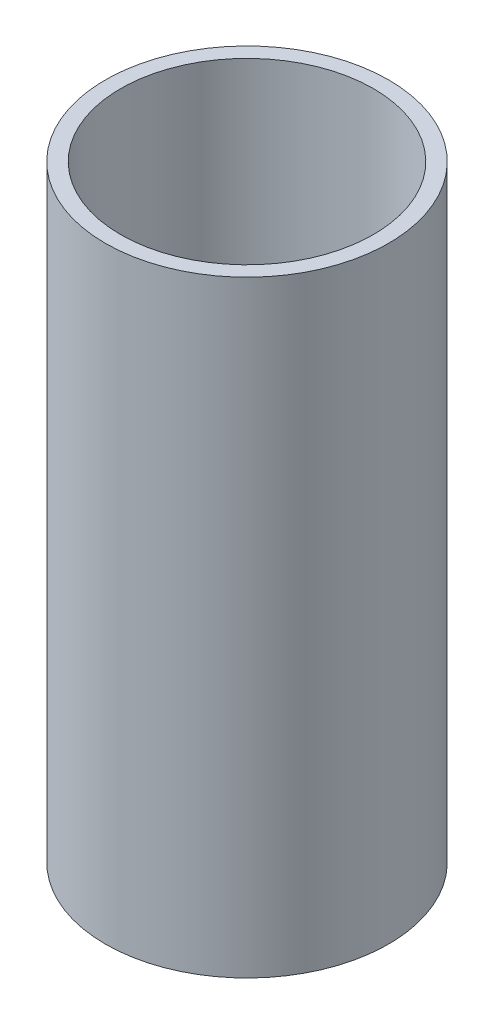
ISO-10303-21;
HEADER;
FILE_DESCRIPTION(('STEP AP214'),'2;1');
FILE_NAME('part.step','',(''),(''),'','','');
FILE_SCHEMA(('AUTOMOTIVE_DESIGN { 1 0 10303 214 1 1 1 1 }'));
ENDSEC;
DATA;
#1=APPLICATION_CONTEXT('core data for automotive mechanical design processes');
#2=APPLICATION_PROTOCOL_DEFINITION('international standard','automotive_design',2000,#1);
#3=PRODUCT_CONTEXT('',#1,'mechanical');
#4=PRODUCT('Part','Part','',(#3));
#5=PRODUCT_RELATED_PRODUCT_CATEGORY('part','',(#4));
#6=PRODUCT_DEFINITION_FORMATION('','',#4);
#7=PRODUCT_DEFINITION_CONTEXT('part definition',#1,'design');
#8=PRODUCT_DEFINITION('design','',#6,#7);
#9=PRODUCT_DEFINITION_SHAPE('','',#8);
#10=(LENGTH_UNIT() NAMED_UNIT(*) SI_UNIT(.MILLI.,.METRE.));
#11=(NAMED_UNIT(*) PLANE_ANGLE_UNIT() SI_UNIT($,.RADIAN.));
#12=(NAMED_UNIT(*) SI_UNIT($,.STERADIAN.) SOLID_ANGLE_UNIT());
#13=UNCERTAINTY_MEASURE_WITH_UNIT(LENGTH_MEASURE(1.E-05),#10,'distance_accuracy_value','');
#14=(GEOMETRIC_REPRESENTATION_CONTEXT(3) GLOBAL_UNCERTAINTY_ASSIGNED_CONTEXT((#13)) GLOBAL_UNIT_ASSIGNED_CONTEXT((#10,
#11,#12)) REPRESENTATION_CONTEXT('',''));
#15=CARTESIAN_POINT('',(0.,0.,0.));
#16=DIRECTION('',(0.,0.,1.));
#17=DIRECTION('',(1.,0.,0.));
#18=AXIS2_PLACEMENT_3D('',#15,#16,#17);
#19=CARTESIAN_POINT('',(0.,60.,0.));
#20=DIRECTION('',(0.,1.,0.));
#21=DIRECTION('',(0.,0.,1.));
#22=AXIS2_PLACEMENT_3D('',#19,#20,#21);
#23=PLANE('',#22);
#24=CARTESIAN_POINT('',(0.,60.,0.));
#25=DIRECTION('',(0.,1.,0.));
#26=DIRECTION('',(0.,0.,1.));
#27=AXIS2_PLACEMENT_3D('',#24,#25,#26);
#28=CIRCLE('',#27,14.);
#29=CARTESIAN_POINT('',(0.,60.,14.));
#30=VERTEX_POINT('',#29);
#31=EDGE_CURVE('E10',#30,#30,#28,.T.);
#32=ORIENTED_EDGE('',*,*,#31,.T.);
#33=EDGE_LOOP('',(#32));
#34=FACE_BOUND('',#33,.T.);
#35=CARTESIAN_POINT('',(0.,60.,0.));
#36=DIRECTION('',(0.,1.,0.));
#37=DIRECTION('',(0.,0.,1.));
#38=AXIS2_PLACEMENT_3D('',#35,#36,#37);
#39=CIRCLE('',#38,12.5);
#40=CARTESIAN_POINT('',(0.,60.,12.5));
#41=VERTEX_POINT('',#40);
#42=EDGE_CURVE('E42',#41,#41,#39,.T.);
#43=ORIENTED_EDGE('',*,*,#42,.F.);
#44=EDGE_LOOP('',(#43));
#45=FACE_BOUND('',#44,.T.);
#46=ADVANCED_FACE('F31',(#34,#45),#23,.T.);
#47=CARTESIAN_POINT('',(0.,0.,0.));
#48=DIRECTION('',(0.,1.,0.));
#49=DIRECTION('',(0.,0.,1.));
#50=AXIS2_PLACEMENT_3D('',#47,#48,#49);
#51=PLANE('',#50);
#52=CARTESIAN_POINT('',(0.,0.,0.));
#53=DIRECTION('',(0.,1.,0.));
#54=DIRECTION('',(0.,0.,1.));
#55=AXIS2_PLACEMENT_3D('',#52,#53,#54);
#56=CIRCLE('',#55,14.);
#57=CARTESIAN_POINT('',(0.,0.,14.));
#58=VERTEX_POINT('',#57);
#59=EDGE_CURVE('E35',#58,#58,#56,.T.);
#60=ORIENTED_EDGE('',*,*,#59,.F.);
#61=EDGE_LOOP('',(#60));
#62=FACE_BOUND('',#61,.T.);
#63=CARTESIAN_POINT('',(0.,0.,0.));
#64=DIRECTION('',(0.,1.,0.));
#65=DIRECTION('',(0.,0.,1.));
#66=AXIS2_PLACEMENT_3D('',#63,#64,#65);
#67=CIRCLE('',#66,12.5);
#68=CARTESIAN_POINT('',(0.,0.,12.5));
#69=VERTEX_POINT('',#68);
#70=EDGE_CURVE('E44',#69,#69,#67,.T.);
#71=ORIENTED_EDGE('',*,*,#70,.T.);
#72=EDGE_LOOP('',(#71));
#73=FACE_BOUND('',#72,.T.);
#74=ADVANCED_FACE('F54',(#62,#73),#51,.F.);
#75=CARTESIAN_POINT('',(0.,60.,0.));
#76=DIRECTION('',(0.,-1.,0.));
#77=DIRECTION('',(0.,0.,-1.));
#78=AXIS2_PLACEMENT_3D('',#75,#76,#77);
#79=CYLINDRICAL_SURFACE('',#78,14.);
#80=ORIENTED_EDGE('',*,*,#31,.F.);
#81=EDGE_LOOP('',(#80));
#82=FACE_BOUND('',#81,.T.);
#83=ORIENTED_EDGE('',*,*,#59,.T.);
#84=EDGE_LOOP('',(#83));
#85=FACE_BOUND('',#84,.T.);
#86=ADVANCED_FACE('F33',(#82,#85),#79,.T.);
#87=CARTESIAN_POINT('',(0.,60.,0.));
#88=DIRECTION('',(0.,-1.,0.));
#89=DIRECTION('',(0.,0.,-1.));
#90=AXIS2_PLACEMENT_3D('',#87,#88,#89);
#91=CYLINDRICAL_SURFACE('',#90,12.5);
#92=ORIENTED_EDGE('',*,*,#42,.T.);
#93=EDGE_LOOP('',(#92));
#94=FACE_BOUND('',#93,.T.);
#95=ORIENTED_EDGE('',*,*,#70,.F.);
#96=EDGE_LOOP('',(#95));
#97=FACE_BOUND('',#96,.T.);
#98=ADVANCED_FACE('F50',(#94,#97),#91,.F.);
#99=CLOSED_SHELL('',(#46,#74,#86,#98));
#100=MANIFOLD_SOLID_BREP('B2',#99);
#101=ADVANCED_BREP_SHAPE_REPRESENTATION('',(#18,#100),#14);
#102=SHAPE_DEFINITION_REPRESENTATION(#9,#101);
ENDSEC;
END-ISO-10303-21;
